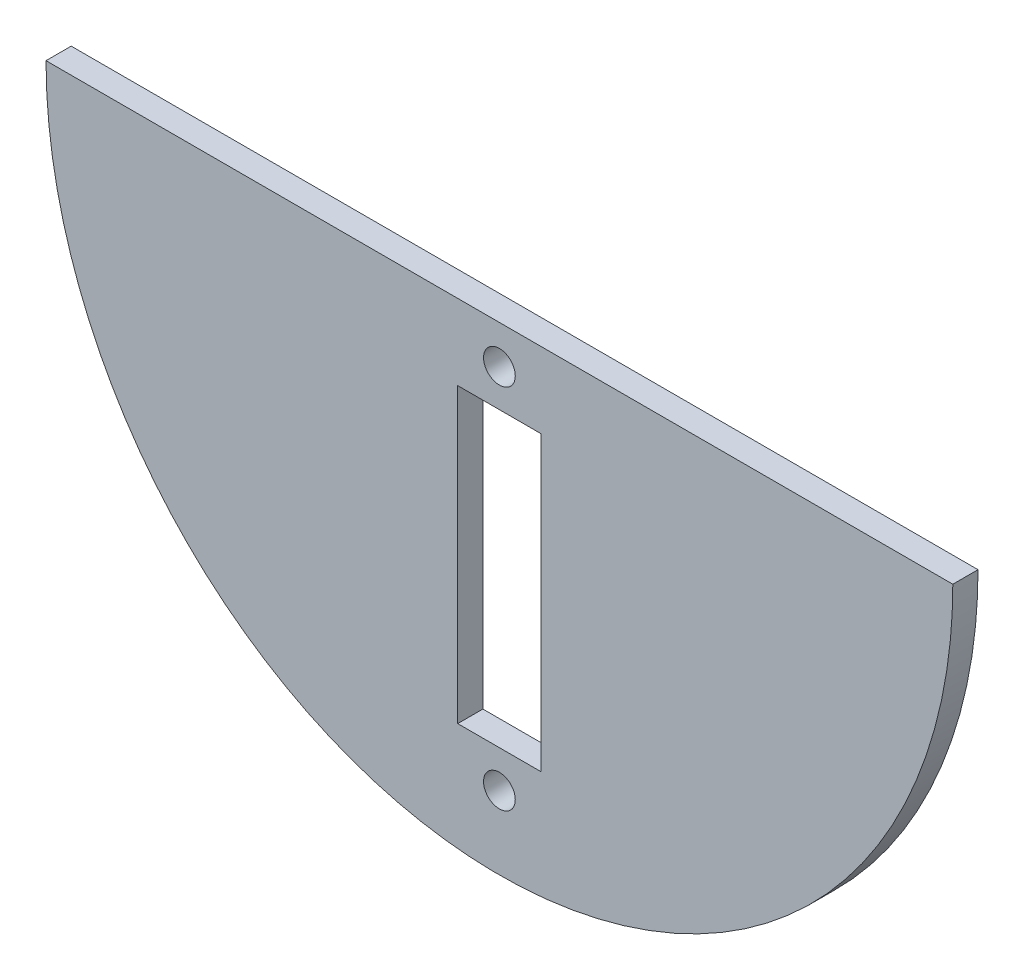
ISO-10303-21;
HEADER;
FILE_DESCRIPTION(('STEP AP214'),'2;1');
FILE_NAME('part.step','',(''),(''),'','','');
FILE_SCHEMA(('AUTOMOTIVE_DESIGN { 1 0 10303 214 1 1 1 1 }'));
ENDSEC;
DATA;
#1=APPLICATION_CONTEXT('core data for automotive mechanical design processes');
#2=APPLICATION_PROTOCOL_DEFINITION('international standard','automotive_design',2000,#1);
#3=PRODUCT_CONTEXT('',#1,'mechanical');
#4=PRODUCT('Part','Part','',(#3));
#5=PRODUCT_RELATED_PRODUCT_CATEGORY('part','',(#4));
#6=PRODUCT_DEFINITION_FORMATION('','',#4);
#7=PRODUCT_DEFINITION_CONTEXT('part definition',#1,'design');
#8=PRODUCT_DEFINITION('design','',#6,#7);
#9=PRODUCT_DEFINITION_SHAPE('','',#8);
#10=(LENGTH_UNIT() NAMED_UNIT(*) SI_UNIT(.MILLI.,.METRE.));
#11=(NAMED_UNIT(*) PLANE_ANGLE_UNIT() SI_UNIT($,.RADIAN.));
#12=(NAMED_UNIT(*) SI_UNIT($,.STERADIAN.) SOLID_ANGLE_UNIT());
#13=UNCERTAINTY_MEASURE_WITH_UNIT(LENGTH_MEASURE(1.E-05),#10,'distance_accuracy_value','');
#14=(GEOMETRIC_REPRESENTATION_CONTEXT(3) GLOBAL_UNCERTAINTY_ASSIGNED_CONTEXT((#13)) GLOBAL_UNIT_ASSIGNED_CONTEXT((#10,
#11,#12)) REPRESENTATION_CONTEXT('',''));
#15=CARTESIAN_POINT('',(0.,0.,0.));
#16=DIRECTION('',(0.,0.,1.));
#17=DIRECTION('',(1.,0.,0.));
#18=AXIS2_PLACEMENT_3D('',#15,#16,#17);
#19=CARTESIAN_POINT('',(-103.421343613317,133.262997237982,2.54));
#20=DIRECTION('',(0.,0.,1.));
#21=DIRECTION('',(1.,0.,0.));
#22=AXIS2_PLACEMENT_3D('',#19,#20,#21);
#23=PLANE('',#22);
#24=CARTESIAN_POINT('',(-103.421343613317,129.392997357982,2.54));
#25=DIRECTION('',(0.,0.,1.));
#26=DIRECTION('',(1.,0.,0.));
#27=AXIS2_PLACEMENT_3D('',#24,#25,#26);
#28=CIRCLE('',#27,1.59999934000001);
#29=CARTESIAN_POINT('',(-101.821344273317,129.392997357982,2.54));
#30=VERTEX_POINT('',#29);
#31=EDGE_CURVE('E116',#30,#30,#28,.T.);
#32=ORIENTED_EDGE('',*,*,#31,.F.);
#33=EDGE_LOOP('',(#32));
#34=FACE_BOUND('',#33,.T.);
#35=CARTESIAN_POINT('',(-103.421343613317,133.262997237982,2.54));
#36=DIRECTION('',(0.,0.,1.));
#37=DIRECTION('',(0.,1.,0.));
#38=AXIS2_PLACEMENT_3D('',#35,#36,#37);
#39=ELLIPSE('',#38,48.26,45.7199999999998);
#40=CARTESIAN_POINT('',(-149.141343613317,133.262997237982,2.54));
#41=VERTEX_POINT('',#40);
#42=CARTESIAN_POINT('',(-57.7013436133171,133.262997237982,2.54));
#43=VERTEX_POINT('',#42);
#44=EDGE_CURVE('E125',#41,#43,#39,.T.);
#45=ORIENTED_EDGE('',*,*,#44,.T.);
#46=DIRECTION('',(-1.,0.,0.));
#47=VECTOR('',#46,1.);
#48=CARTESIAN_POINT('',(-149.141343613317,133.262997237982,2.54));
#49=LINE('',#48,#47);
#50=EDGE_CURVE('E129',#43,#41,#49,.T.);
#51=ORIENTED_EDGE('',*,*,#50,.T.);
#52=EDGE_LOOP('',(#45,#51));
#53=FACE_BOUND('',#52,.T.);
#54=DIRECTION('',(1.,0.,0.));
#55=VECTOR('',#54,1.);
#56=CARTESIAN_POINT('',(-107.625043613317,96.1281972379818,2.54));
#57=LINE('',#56,#55);
#58=CARTESIAN_POINT('',(-107.625043613317,96.1281972379818,2.54));
#59=VERTEX_POINT('',#58);
#60=CARTESIAN_POINT('',(-99.2176436133167,96.1281972379819,2.54));
#61=VERTEX_POINT('',#60);
#62=EDGE_CURVE('E95',#59,#61,#57,.T.);
#63=ORIENTED_EDGE('',*,*,#62,.F.);
#64=DIRECTION('',(0.,-1.,0.));
#65=VECTOR('',#64,1.);
#66=CARTESIAN_POINT('',(-107.625043613317,96.1281972379818,2.54));
#67=LINE('',#66,#65);
#68=CARTESIAN_POINT('',(-107.625043613317,125.642997237982,2.54));
#69=VERTEX_POINT('',#68);
#70=EDGE_CURVE('E87',#69,#59,#67,.T.);
#71=ORIENTED_EDGE('',*,*,#70,.F.);
#72=DIRECTION('',(-1.,0.,0.));
#73=VECTOR('',#72,1.);
#74=CARTESIAN_POINT('',(-107.625043613317,125.642997237982,2.54));
#75=LINE('',#74,#73);
#76=CARTESIAN_POINT('',(-99.2176436133168,125.642997237982,2.54));
#77=VERTEX_POINT('',#76);
#78=EDGE_CURVE('E110',#77,#69,#75,.T.);
#79=ORIENTED_EDGE('',*,*,#78,.F.);
#80=DIRECTION('',(0.,1.,0.));
#81=VECTOR('',#80,1.);
#82=CARTESIAN_POINT('',(-99.2176436133168,125.642997237982,2.54));
#83=LINE('',#82,#81);
#84=EDGE_CURVE('E108',#61,#77,#83,.T.);
#85=ORIENTED_EDGE('',*,*,#84,.F.);
#86=EDGE_LOOP('',(#63,#71,#79,#85));
#87=FACE_BOUND('',#86,.T.);
#88=CARTESIAN_POINT('',(-103.421343613317,92.3781971179818,2.54));
#89=DIRECTION('',(0.,0.,1.));
#90=DIRECTION('',(1.,0.,0.));
#91=AXIS2_PLACEMENT_3D('',#88,#89,#90);
#92=CIRCLE('',#91,1.59999934000001);
#93=CARTESIAN_POINT('',(-101.821344273317,92.3781971179818,2.54));
#94=VERTEX_POINT('',#93);
#95=EDGE_CURVE('E236',#94,#94,#92,.T.);
#96=ORIENTED_EDGE('',*,*,#95,.F.);
#97=EDGE_LOOP('',(#96));
#98=FACE_BOUND('',#97,.T.);
#99=ADVANCED_FACE('F33',(#34,#53,#87,#98),#23,.T.);
#100=CARTESIAN_POINT('',(-103.421343613317,133.262997237982,0.));
#101=DIRECTION('',(0.,0.,1.));
#102=DIRECTION('',(1.,0.,0.));
#103=AXIS2_PLACEMENT_3D('',#100,#101,#102);
#104=PLANE('',#103);
#105=CARTESIAN_POINT('',(-103.421343613317,133.262997237982,0.));
#106=DIRECTION('',(0.,0.,1.));
#107=DIRECTION('',(0.,1.,0.));
#108=AXIS2_PLACEMENT_3D('',#105,#106,#107);
#109=ELLIPSE('',#108,48.26,45.7199999999998);
#110=CARTESIAN_POINT('',(-149.141343613317,133.262997237982,0.));
#111=VERTEX_POINT('',#110);
#112=CARTESIAN_POINT('',(-57.7013436133171,133.262997237982,0.));
#113=VERTEX_POINT('',#112);
#114=EDGE_CURVE('E103',#111,#113,#109,.T.);
#115=ORIENTED_EDGE('',*,*,#114,.F.);
#116=DIRECTION('',(-1.,0.,0.));
#117=VECTOR('',#116,1.);
#118=CARTESIAN_POINT('',(-149.141343613317,133.262997237982,0.));
#119=LINE('',#118,#117);
#120=EDGE_CURVE('E130',#113,#111,#119,.T.);
#121=ORIENTED_EDGE('',*,*,#120,.F.);
#122=EDGE_LOOP('',(#115,#121));
#123=FACE_BOUND('',#122,.T.);
#124=DIRECTION('',(0.,-1.,0.));
#125=VECTOR('',#124,1.);
#126=CARTESIAN_POINT('',(-107.625043613317,96.1281972379818,0.));
#127=LINE('',#126,#125);
#128=CARTESIAN_POINT('',(-107.625043613317,125.642997237982,0.));
#129=VERTEX_POINT('',#128);
#130=CARTESIAN_POINT('',(-107.625043613317,96.1281972379818,0.));
#131=VERTEX_POINT('',#130);
#132=EDGE_CURVE('E57',#129,#131,#127,.T.);
#133=ORIENTED_EDGE('',*,*,#132,.T.);
#134=DIRECTION('',(1.,0.,0.));
#135=VECTOR('',#134,1.);
#136=CARTESIAN_POINT('',(-107.625043613317,96.1281972379818,0.));
#137=LINE('',#136,#135);
#138=CARTESIAN_POINT('',(-99.2176436133167,96.1281972379819,0.));
#139=VERTEX_POINT('',#138);
#140=EDGE_CURVE('E102',#131,#139,#137,.T.);
#141=ORIENTED_EDGE('',*,*,#140,.T.);
#142=DIRECTION('',(0.,1.,0.));
#143=VECTOR('',#142,1.);
#144=CARTESIAN_POINT('',(-99.2176436133168,125.642997237982,0.));
#145=LINE('',#144,#143);
#146=CARTESIAN_POINT('',(-99.2176436133168,125.642997237982,0.));
#147=VERTEX_POINT('',#146);
#148=EDGE_CURVE('E118',#139,#147,#145,.T.);
#149=ORIENTED_EDGE('',*,*,#148,.T.);
#150=DIRECTION('',(-1.,0.,0.));
#151=VECTOR('',#150,1.);
#152=CARTESIAN_POINT('',(-107.625043613317,125.642997237982,0.));
#153=LINE('',#152,#151);
#154=EDGE_CURVE('E96',#147,#129,#153,.T.);
#155=ORIENTED_EDGE('',*,*,#154,.T.);
#156=EDGE_LOOP('',(#133,#141,#149,#155));
#157=FACE_BOUND('',#156,.T.);
#158=CARTESIAN_POINT('',(-103.421343613317,129.392997357982,0.));
#159=DIRECTION('',(0.,0.,1.));
#160=DIRECTION('',(1.,0.,0.));
#161=AXIS2_PLACEMENT_3D('',#158,#159,#160);
#162=CIRCLE('',#161,1.59999934000001);
#163=CARTESIAN_POINT('',(-101.821344273317,129.392997357982,0.));
#164=VERTEX_POINT('',#163);
#165=EDGE_CURVE('E242',#164,#164,#162,.T.);
#166=ORIENTED_EDGE('',*,*,#165,.T.);
#167=EDGE_LOOP('',(#166));
#168=FACE_BOUND('',#167,.T.);
#169=CARTESIAN_POINT('',(-103.421343613317,92.3781971179818,0.));
#170=DIRECTION('',(0.,0.,1.));
#171=DIRECTION('',(1.,0.,0.));
#172=AXIS2_PLACEMENT_3D('',#169,#170,#171);
#173=CIRCLE('',#172,1.59999934000001);
#174=CARTESIAN_POINT('',(-101.821344273317,92.3781971179818,0.));
#175=VERTEX_POINT('',#174);
#176=EDGE_CURVE('E239',#175,#175,#173,.T.);
#177=ORIENTED_EDGE('',*,*,#176,.T.);
#178=EDGE_LOOP('',(#177));
#179=FACE_BOUND('',#178,.T.);
#180=ADVANCED_FACE('F142',(#123,#157,#168,#179),#104,.F.);
#181=DIRECTION('',(0.,0.,-1.));
#182=VECTOR('',#181,1.);
#183=SURFACE_OF_LINEAR_EXTRUSION('',#39,#182);
#184=ORIENTED_EDGE('',*,*,#114,.T.);
#185=DIRECTION('',(0.,0.,-1.));
#186=VECTOR('',#185,1.);
#187=CARTESIAN_POINT('',(-57.7013436133171,133.262997237982,2.54));
#188=LINE('',#187,#186);
#189=EDGE_CURVE('E11',#43,#113,#188,.T.);
#190=ORIENTED_EDGE('',*,*,#189,.F.);
#191=ORIENTED_EDGE('',*,*,#44,.F.);
#192=DIRECTION('',(0.,0.,-1.));
#193=VECTOR('',#192,1.);
#194=CARTESIAN_POINT('',(-149.141343613317,133.262997237982,2.54));
#195=LINE('',#194,#193);
#196=EDGE_CURVE('E42',#41,#111,#195,.T.);
#197=ORIENTED_EDGE('',*,*,#196,.T.);
#198=EDGE_LOOP('',(#184,#190,#191,#197));
#199=FACE_BOUND('',#198,.T.);
#200=ADVANCED_FACE('F35',(#199),#183,.F.);
#201=CARTESIAN_POINT('',(-149.141343613317,133.262997237982,2.54));
#202=DIRECTION('',(0.,-1.,0.));
#203=DIRECTION('',(1.,0.,0.));
#204=AXIS2_PLACEMENT_3D('',#201,#202,#203);
#205=PLANE('',#204);
#206=ORIENTED_EDGE('',*,*,#120,.T.);
#207=ORIENTED_EDGE('',*,*,#196,.F.);
#208=ORIENTED_EDGE('',*,*,#50,.F.);
#209=ORIENTED_EDGE('',*,*,#189,.T.);
#210=EDGE_LOOP('',(#206,#207,#208,#209));
#211=FACE_BOUND('',#210,.T.);
#212=ADVANCED_FACE('F144',(#211),#205,.F.);
#213=CARTESIAN_POINT('',(-107.625043613317,96.1281972379818,2.54));
#214=DIRECTION('',(1.,0.,0.));
#215=DIRECTION('',(0.,1.,0.));
#216=AXIS2_PLACEMENT_3D('',#213,#214,#215);
#217=PLANE('',#216);
#218=ORIENTED_EDGE('',*,*,#132,.F.);
#219=DIRECTION('',(0.,0.,-1.));
#220=VECTOR('',#219,1.);
#221=CARTESIAN_POINT('',(-107.625043613317,125.642997237982,2.54));
#222=LINE('',#221,#220);
#223=EDGE_CURVE('E91',#69,#129,#222,.T.);
#224=ORIENTED_EDGE('',*,*,#223,.F.);
#225=ORIENTED_EDGE('',*,*,#70,.T.);
#226=DIRECTION('',(0.,0.,-1.));
#227=VECTOR('',#226,1.);
#228=CARTESIAN_POINT('',(-107.625043613317,96.1281972379818,2.54));
#229=LINE('',#228,#227);
#230=EDGE_CURVE('E90',#59,#131,#229,.T.);
#231=ORIENTED_EDGE('',*,*,#230,.T.);
#232=EDGE_LOOP('',(#218,#224,#225,#231));
#233=FACE_BOUND('',#232,.T.);
#234=ADVANCED_FACE('F89',(#233),#217,.T.);
#235=CARTESIAN_POINT('',(-107.625043613317,96.1281972379818,2.54));
#236=DIRECTION('',(0.,1.,0.));
#237=DIRECTION('',(-1.,0.,0.));
#238=AXIS2_PLACEMENT_3D('',#235,#236,#237);
#239=PLANE('',#238);
#240=ORIENTED_EDGE('',*,*,#140,.F.);
#241=ORIENTED_EDGE('',*,*,#230,.F.);
#242=ORIENTED_EDGE('',*,*,#62,.T.);
#243=DIRECTION('',(0.,0.,-1.));
#244=VECTOR('',#243,1.);
#245=CARTESIAN_POINT('',(-99.2176436133167,96.1281972379819,2.54));
#246=LINE('',#245,#244);
#247=EDGE_CURVE('E104',#61,#139,#246,.T.);
#248=ORIENTED_EDGE('',*,*,#247,.T.);
#249=EDGE_LOOP('',(#240,#241,#242,#248));
#250=FACE_BOUND('',#249,.T.);
#251=ADVANCED_FACE('F99',(#250),#239,.T.);
#252=CARTESIAN_POINT('',(-99.2176436133168,125.642997237982,2.54));
#253=DIRECTION('',(-1.,0.,0.));
#254=DIRECTION('',(0.,-1.,0.));
#255=AXIS2_PLACEMENT_3D('',#252,#253,#254);
#256=PLANE('',#255);
#257=ORIENTED_EDGE('',*,*,#148,.F.);
#258=ORIENTED_EDGE('',*,*,#247,.F.);
#259=ORIENTED_EDGE('',*,*,#84,.T.);
#260=DIRECTION('',(0.,0.,-1.));
#261=VECTOR('',#260,1.);
#262=CARTESIAN_POINT('',(-99.2176436133168,125.642997237982,2.54));
#263=LINE('',#262,#261);
#264=EDGE_CURVE('E49',#77,#147,#263,.T.);
#265=ORIENTED_EDGE('',*,*,#264,.T.);
#266=EDGE_LOOP('',(#257,#258,#259,#265));
#267=FACE_BOUND('',#266,.T.);
#268=ADVANCED_FACE('F192',(#267),#256,.T.);
#269=CARTESIAN_POINT('',(-107.625043613317,125.642997237982,2.54));
#270=DIRECTION('',(0.,-1.,0.));
#271=DIRECTION('',(1.,0.,0.));
#272=AXIS2_PLACEMENT_3D('',#269,#270,#271);
#273=PLANE('',#272);
#274=ORIENTED_EDGE('',*,*,#154,.F.);
#275=ORIENTED_EDGE('',*,*,#264,.F.);
#276=ORIENTED_EDGE('',*,*,#78,.T.);
#277=ORIENTED_EDGE('',*,*,#223,.T.);
#278=EDGE_LOOP('',(#274,#275,#276,#277));
#279=FACE_BOUND('',#278,.T.);
#280=ADVANCED_FACE('F199',(#279),#273,.T.);
#281=CARTESIAN_POINT('',(-103.421343613317,129.392997357982,2.54));
#282=DIRECTION('',(0.,0.,-1.));
#283=DIRECTION('',(-1.,0.,0.));
#284=AXIS2_PLACEMENT_3D('',#281,#282,#283);
#285=CYLINDRICAL_SURFACE('',#284,1.59999934000001);
#286=ORIENTED_EDGE('',*,*,#31,.T.);
#287=EDGE_LOOP('',(#286));
#288=FACE_BOUND('',#287,.T.);
#289=ORIENTED_EDGE('',*,*,#165,.F.);
#290=EDGE_LOOP('',(#289));
#291=FACE_BOUND('',#290,.T.);
#292=ADVANCED_FACE('F208',(#288,#291),#285,.F.);
#293=CARTESIAN_POINT('',(-103.421343613317,92.3781971179818,2.54));
#294=DIRECTION('',(0.,0.,-1.));
#295=DIRECTION('',(-1.,0.,0.));
#296=AXIS2_PLACEMENT_3D('',#293,#294,#295);
#297=CYLINDRICAL_SURFACE('',#296,1.59999934000001);
#298=ORIENTED_EDGE('',*,*,#95,.T.);
#299=EDGE_LOOP('',(#298));
#300=FACE_BOUND('',#299,.T.);
#301=ORIENTED_EDGE('',*,*,#176,.F.);
#302=EDGE_LOOP('',(#301));
#303=FACE_BOUND('',#302,.T.);
#304=ADVANCED_FACE('F216',(#300,#303),#297,.F.);
#305=CLOSED_SHELL('',(#99,#180,#200,#212,#234,#251,#268,#280,#292,#304));
#306=MANIFOLD_SOLID_BREP('B2',#305);
#307=ADVANCED_BREP_SHAPE_REPRESENTATION('',(#18,#306),#14);
#308=SHAPE_DEFINITION_REPRESENTATION(#9,#307);
ENDSEC;
END-ISO-10303-21;
